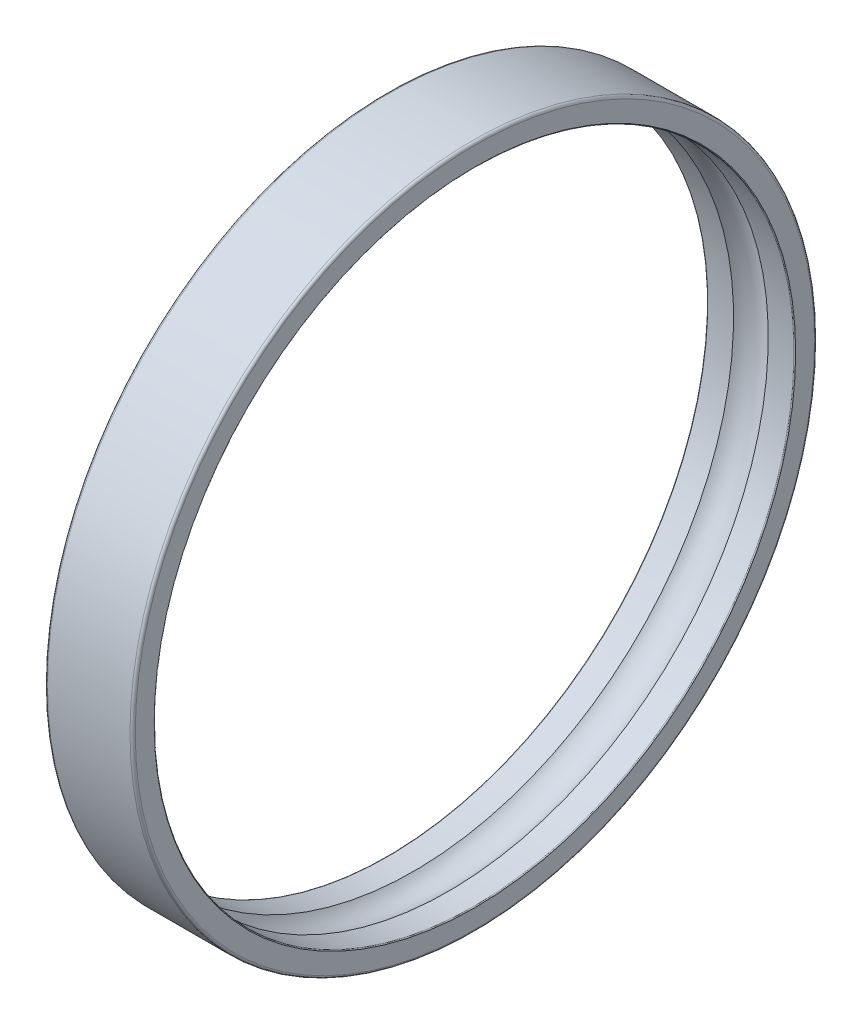
ISO-10303-21;
HEADER;
FILE_DESCRIPTION(('STEP AP214'),'2;1');
FILE_NAME('part.step','',(''),(''),'','','');
FILE_SCHEMA(('AUTOMOTIVE_DESIGN { 1 0 10303 214 1 1 1 1 }'));
ENDSEC;
DATA;
#1=APPLICATION_CONTEXT('core data for automotive mechanical design processes');
#2=APPLICATION_PROTOCOL_DEFINITION('international standard','automotive_design',2000,#1);
#3=PRODUCT_CONTEXT('',#1,'mechanical');
#4=PRODUCT('Part','Part','',(#3));
#5=PRODUCT_RELATED_PRODUCT_CATEGORY('part','',(#4));
#6=PRODUCT_DEFINITION_FORMATION('','',#4);
#7=PRODUCT_DEFINITION_CONTEXT('part definition',#1,'design');
#8=PRODUCT_DEFINITION('design','',#6,#7);
#9=PRODUCT_DEFINITION_SHAPE('','',#8);
#10=(LENGTH_UNIT() NAMED_UNIT(*) SI_UNIT(.MILLI.,.METRE.));
#11=(NAMED_UNIT(*) PLANE_ANGLE_UNIT() SI_UNIT($,.RADIAN.));
#12=(NAMED_UNIT(*) SI_UNIT($,.STERADIAN.) SOLID_ANGLE_UNIT());
#13=UNCERTAINTY_MEASURE_WITH_UNIT(LENGTH_MEASURE(1.E-05),#10,'distance_accuracy_value','');
#14=(GEOMETRIC_REPRESENTATION_CONTEXT(3) GLOBAL_UNCERTAINTY_ASSIGNED_CONTEXT((#13)) GLOBAL_UNIT_ASSIGNED_CONTEXT((#10,
#11,#12)) REPRESENTATION_CONTEXT('',''));
#15=CARTESIAN_POINT('',(0.,0.,0.));
#16=DIRECTION('',(0.,0.,1.));
#17=DIRECTION('',(1.,0.,0.));
#18=AXIS2_PLACEMENT_3D('',#15,#16,#17);
#19=CARTESIAN_POINT('',(0.,-39.1288130231702,-38.7));
#20=DIRECTION('',(-1.,0.,0.));
#21=DIRECTION('',(0.,0.,1.));
#22=AXIS2_PLACEMENT_3D('',#19,#20,#21);
#23=PLANE('',#22);
#24=CARTESIAN_POINT('',(0.,0.,0.));
#25=DIRECTION('',(-1.,0.,0.));
#26=DIRECTION('',(0.,0.,-1.));
#27=AXIS2_PLACEMENT_3D('',#24,#25,#26);
#28=CIRCLE('',#27,38.7);
#29=CARTESIAN_POINT('',(0.,0.,-38.7));
#30=VERTEX_POINT('',#29);
#31=EDGE_CURVE('E50',#30,#30,#28,.F.);
#32=ORIENTED_EDGE('',*,*,#31,.F.);
#33=EDGE_LOOP('',(#32));
#34=FACE_BOUND('',#33,.T.);
#35=CARTESIAN_POINT('',(0.,0.,0.));
#36=DIRECTION('',(1.,0.,0.));
#37=DIRECTION('',(0.,0.,1.));
#38=AXIS2_PLACEMENT_3D('',#35,#36,#37);
#39=CIRCLE('',#38,36.5499999999994);
#40=CARTESIAN_POINT('',(0.,0.,36.5499999999994));
#41=VERTEX_POINT('',#40);
#42=EDGE_CURVE('E47',#41,#41,#39,.T.);
#43=ORIENTED_EDGE('',*,*,#42,.T.);
#44=EDGE_LOOP('',(#43));
#45=FACE_BOUND('',#44,.T.);
#46=ADVANCED_FACE('F15',(#34,#45),#23,.T.);
#47=CARTESIAN_POINT('',(10.,-39.1288129608838,38.7));
#48=DIRECTION('',(1.,0.,0.));
#49=DIRECTION('',(0.,0.,-1.));
#50=AXIS2_PLACEMENT_3D('',#47,#48,#49);
#51=PLANE('',#50);
#52=CARTESIAN_POINT('',(10.,0.,0.));
#53=DIRECTION('',(1.,0.,0.));
#54=DIRECTION('',(0.,-1.16850827607096E-09,1.));
#55=AXIS2_PLACEMENT_3D('',#52,#53,#54);
#56=CIRCLE('',#55,38.7);
#57=CARTESIAN_POINT('',(10.,-4.52212702839461E-08,38.7));
#58=VERTEX_POINT('',#57);
#59=EDGE_CURVE('E44',#58,#58,#56,.T.);
#60=ORIENTED_EDGE('',*,*,#59,.T.);
#61=EDGE_LOOP('',(#60));
#62=FACE_BOUND('',#61,.T.);
#63=CARTESIAN_POINT('',(10.,0.,0.));
#64=DIRECTION('',(-1.,0.,0.));
#65=DIRECTION('',(0.,0.,-1.));
#66=AXIS2_PLACEMENT_3D('',#63,#64,#65);
#67=CIRCLE('',#66,36.5500000268214);
#68=CARTESIAN_POINT('',(10.,0.,-36.5500000268214));
#69=VERTEX_POINT('',#68);
#70=EDGE_CURVE('E41',#69,#69,#67,.F.);
#71=ORIENTED_EDGE('',*,*,#70,.F.);
#72=EDGE_LOOP('',(#71));
#73=FACE_BOUND('',#72,.T.);
#74=ADVANCED_FACE('F59',(#62,#73),#51,.T.);
#75=CARTESIAN_POINT('',(0.299999999999939,0.,0.));
#76=DIRECTION('',(1.,0.,0.));
#77=DIRECTION('',(0.,1.92332050626273E-10,1.));
#78=AXIS2_PLACEMENT_3D('',#75,#76,#77);
#79=TOROIDAL_SURFACE('',#78,38.7,0.299999999999939);
#80=ORIENTED_EDGE('',*,*,#31,.T.);
#81=EDGE_LOOP('',(#80));
#82=FACE_BOUND('',#81,.T.);
#83=CARTESIAN_POINT('',(0.299999999999939,0.,0.));
#84=DIRECTION('',(-1.,0.,0.));
#85=DIRECTION('',(0.,0.,-1.));
#86=AXIS2_PLACEMENT_3D('',#83,#84,#85);
#87=CIRCLE('',#86,38.9999999999999);
#88=CARTESIAN_POINT('',(0.299999999999939,0.,-38.9999999999999));
#89=VERTEX_POINT('',#88);
#90=EDGE_CURVE('E38',#89,#89,#87,.F.);
#91=ORIENTED_EDGE('',*,*,#90,.F.);
#92=EDGE_LOOP('',(#91));
#93=FACE_BOUND('',#92,.T.);
#94=ADVANCED_FACE('F54',(#82,#93),#79,.T.);
#95=CARTESIAN_POINT('',(0.0999999999994012,0.,0.));
#96=DIRECTION('',(1.,0.,0.));
#97=DIRECTION('',(0.,0.,1.));
#98=AXIS2_PLACEMENT_3D('',#95,#96,#97);
#99=TOROIDAL_SURFACE('',#98,36.5499999999994,0.0999999999994012);
#100=CARTESIAN_POINT('',(0.100000000000003,0.,0.));
#101=DIRECTION('',(1.,0.,0.));
#102=DIRECTION('',(0.,0.,1.));
#103=AXIS2_PLACEMENT_3D('',#100,#101,#102);
#104=CIRCLE('',#103,36.45);
#105=CARTESIAN_POINT('',(0.100000000000003,0.,36.45));
#106=VERTEX_POINT('',#105);
#107=EDGE_CURVE('E35',#106,#106,#104,.T.);
#108=ORIENTED_EDGE('',*,*,#107,.T.);
#109=EDGE_LOOP('',(#108));
#110=FACE_BOUND('',#109,.T.);
#111=ORIENTED_EDGE('',*,*,#42,.F.);
#112=EDGE_LOOP('',(#111));
#113=FACE_BOUND('',#112,.T.);
#114=ADVANCED_FACE('F63',(#110,#113),#99,.T.);
#115=CARTESIAN_POINT('',(50.,0.,0.));
#116=DIRECTION('',(1.,0.,0.));
#117=DIRECTION('',(0.,0.,1.));
#118=AXIS2_PLACEMENT_3D('',#115,#116,#117);
#119=CYLINDRICAL_SURFACE('',#118,36.45);
#120=CARTESIAN_POINT('',(3.0214186900711,0.,0.));
#121=DIRECTION('',(1.,0.,0.));
#122=DIRECTION('',(0.,0.,1.));
#123=AXIS2_PLACEMENT_3D('',#120,#121,#122);
#124=CIRCLE('',#123,36.45);
#125=CARTESIAN_POINT('',(3.0214186900711,0.,36.45));
#126=VERTEX_POINT('',#125);
#127=EDGE_CURVE('E30',#126,#126,#124,.T.);
#128=ORIENTED_EDGE('',*,*,#127,.T.);
#129=EDGE_LOOP('',(#128));
#130=FACE_BOUND('',#129,.T.);
#131=ORIENTED_EDGE('',*,*,#107,.F.);
#132=EDGE_LOOP('',(#131));
#133=FACE_BOUND('',#132,.T.);
#134=ADVANCED_FACE('F65',(#130,#133),#119,.F.);
#135=CARTESIAN_POINT('',(5.,0.,0.));
#136=DIRECTION('',(1.,0.,0.));
#137=DIRECTION('',(0.,0.,1.));
#138=AXIS2_PLACEMENT_3D('',#135,#136,#137);
#139=TOROIDAL_SURFACE('',#138,34.5,2.778);
#140=ORIENTED_EDGE('',*,*,#127,.F.);
#141=EDGE_LOOP('',(#140));
#142=FACE_BOUND('',#141,.T.);
#143=CARTESIAN_POINT('',(6.9785813099289,0.,0.));
#144=DIRECTION('',(1.,0.,0.));
#145=DIRECTION('',(0.,0.,1.));
#146=AXIS2_PLACEMENT_3D('',#143,#144,#145);
#147=CIRCLE('',#146,36.45);
#148=CARTESIAN_POINT('',(6.9785813099289,0.,36.45));
#149=VERTEX_POINT('',#148);
#150=EDGE_CURVE('E26',#149,#149,#147,.T.);
#151=ORIENTED_EDGE('',*,*,#150,.T.);
#152=EDGE_LOOP('',(#151));
#153=FACE_BOUND('',#152,.T.);
#154=ADVANCED_FACE('F73',(#142,#153),#139,.F.);
#155=CARTESIAN_POINT('',(50.,0.,0.));
#156=DIRECTION('',(1.,0.,0.));
#157=DIRECTION('',(0.,0.,1.));
#158=AXIS2_PLACEMENT_3D('',#155,#156,#157);
#159=CYLINDRICAL_SURFACE('',#158,36.45);
#160=CARTESIAN_POINT('',(9.9,0.,0.));
#161=DIRECTION('',(1.,0.,0.));
#162=DIRECTION('',(0.,0.,1.));
#163=AXIS2_PLACEMENT_3D('',#160,#161,#162);
#164=CIRCLE('',#163,36.45);
#165=CARTESIAN_POINT('',(9.9,0.,36.45));
#166=VERTEX_POINT('',#165);
#167=EDGE_CURVE('E22',#166,#166,#164,.T.);
#168=ORIENTED_EDGE('',*,*,#167,.T.);
#169=EDGE_LOOP('',(#168));
#170=FACE_BOUND('',#169,.T.);
#171=ORIENTED_EDGE('',*,*,#150,.F.);
#172=EDGE_LOOP('',(#171));
#173=FACE_BOUND('',#172,.T.);
#174=ADVANCED_FACE('F81',(#170,#173),#159,.F.);
#175=CARTESIAN_POINT('',(9.90000000000068,0.,0.));
#176=DIRECTION('',(1.,0.,0.));
#177=DIRECTION('',(0.,1.16855293253601E-09,1.));
#178=AXIS2_PLACEMENT_3D('',#175,#176,#177);
#179=TOROIDAL_SURFACE('',#178,36.5499999999993,0.0999999999993229);
#180=ORIENTED_EDGE('',*,*,#70,.T.);
#181=EDGE_LOOP('',(#180));
#182=FACE_BOUND('',#181,.T.);
#183=ORIENTED_EDGE('',*,*,#167,.F.);
#184=EDGE_LOOP('',(#183));
#185=FACE_BOUND('',#184,.T.);
#186=ADVANCED_FACE('F85',(#182,#185),#179,.T.);
#187=CARTESIAN_POINT('',(9.70000000000012,0.,0.));
#188=DIRECTION('',(1.,0.,0.));
#189=DIRECTION('',(0.,0.,1.));
#190=AXIS2_PLACEMENT_3D('',#187,#188,#189);
#191=TOROIDAL_SURFACE('',#190,38.7,0.299999999999878);
#192=CARTESIAN_POINT('',(9.70000000000012,0.,0.));
#193=DIRECTION('',(1.,0.,0.));
#194=DIRECTION('',(0.,0.,1.));
#195=AXIS2_PLACEMENT_3D('',#192,#193,#194);
#196=CIRCLE('',#195,38.9999999999999);
#197=CARTESIAN_POINT('',(9.70000000000012,0.,38.9999999999999));
#198=VERTEX_POINT('',#197);
#199=EDGE_CURVE('E10',#198,#198,#196,.T.);
#200=ORIENTED_EDGE('',*,*,#199,.T.);
#201=EDGE_LOOP('',(#200));
#202=FACE_BOUND('',#201,.T.);
#203=ORIENTED_EDGE('',*,*,#59,.F.);
#204=EDGE_LOOP('',(#203));
#205=FACE_BOUND('',#204,.T.);
#206=ADVANCED_FACE('F87',(#202,#205),#191,.T.);
#207=CARTESIAN_POINT('',(50.,0.,0.));
#208=DIRECTION('',(1.,0.,0.));
#209=DIRECTION('',(0.,1.92332050626273E-10,1.));
#210=AXIS2_PLACEMENT_3D('',#207,#208,#209);
#211=CYLINDRICAL_SURFACE('',#210,39.);
#212=ORIENTED_EDGE('',*,*,#90,.T.);
#213=EDGE_LOOP('',(#212));
#214=FACE_BOUND('',#213,.T.);
#215=ORIENTED_EDGE('',*,*,#199,.F.);
#216=EDGE_LOOP('',(#215));
#217=FACE_BOUND('',#216,.T.);
#218=ADVANCED_FACE('F17',(#214,#217),#211,.T.);
#219=CLOSED_SHELL('',(#46,#74,#94,#114,#134,#154,#174,#186,#206,#218));
#220=MANIFOLD_SOLID_BREP('B1',#219);
#221=ADVANCED_BREP_SHAPE_REPRESENTATION('',(#18,#220),#14);
#222=SHAPE_DEFINITION_REPRESENTATION(#9,#221);
ENDSEC;
END-ISO-10303-21;
